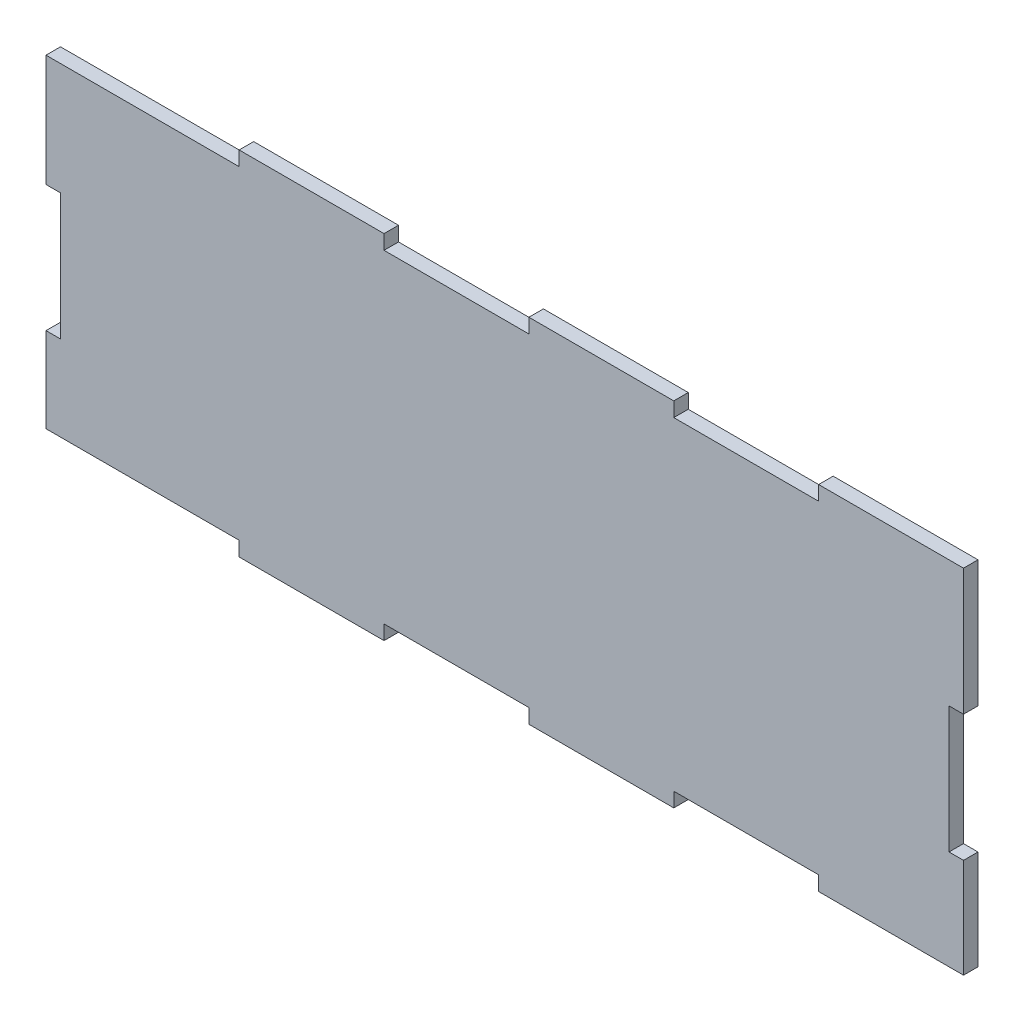
ISO-10303-21;
HEADER;
FILE_DESCRIPTION(('STEP AP214'),'2;1');
FILE_NAME('part.step','',(''),(''),'','','');
FILE_SCHEMA(('AUTOMOTIVE_DESIGN { 1 0 10303 214 1 1 1 1 }'));
ENDSEC;
DATA;
#1=APPLICATION_CONTEXT('core data for automotive mechanical design processes');
#2=APPLICATION_PROTOCOL_DEFINITION('international standard','automotive_design',2000,#1);
#3=PRODUCT_CONTEXT('',#1,'mechanical');
#4=PRODUCT('Part','Part','',(#3));
#5=PRODUCT_RELATED_PRODUCT_CATEGORY('part','',(#4));
#6=PRODUCT_DEFINITION_FORMATION('','',#4);
#7=PRODUCT_DEFINITION_CONTEXT('part definition',#1,'design');
#8=PRODUCT_DEFINITION('design','',#6,#7);
#9=PRODUCT_DEFINITION_SHAPE('','',#8);
#10=(LENGTH_UNIT() NAMED_UNIT(*) SI_UNIT(.MILLI.,.METRE.));
#11=(NAMED_UNIT(*) PLANE_ANGLE_UNIT() SI_UNIT($,.RADIAN.));
#12=(NAMED_UNIT(*) SI_UNIT($,.STERADIAN.) SOLID_ANGLE_UNIT());
#13=UNCERTAINTY_MEASURE_WITH_UNIT(LENGTH_MEASURE(1.E-05),#10,'distance_accuracy_value','');
#14=(GEOMETRIC_REPRESENTATION_CONTEXT(3) GLOBAL_UNCERTAINTY_ASSIGNED_CONTEXT((#13)) GLOBAL_UNIT_ASSIGNED_CONTEXT((#10,
#11,#12)) REPRESENTATION_CONTEXT('',''));
#15=CARTESIAN_POINT('',(0.,0.,0.));
#16=DIRECTION('',(0.,0.,1.));
#17=DIRECTION('',(1.,0.,0.));
#18=AXIS2_PLACEMENT_3D('',#15,#16,#17);
#19=CARTESIAN_POINT('',(0.,46.8,3.));
#20=DIRECTION('',(0.,1.,0.));
#21=DIRECTION('',(0.,0.,1.));
#22=AXIS2_PLACEMENT_3D('',#19,#20,#21);
#23=PLANE('',#22);
#24=DIRECTION('',(1.,0.,0.));
#25=VECTOR('',#24,1.);
#26=CARTESIAN_POINT('',(0.,46.8,0.));
#27=LINE('',#26,#25);
#28=CARTESIAN_POINT('',(-10.,46.8,0.));
#29=VERTEX_POINT('',#28);
#30=CARTESIAN_POINT('',(-7.,46.8,0.));
#31=VERTEX_POINT('',#30);
#32=EDGE_CURVE('E274',#29,#31,#27,.T.);
#33=ORIENTED_EDGE('',*,*,#32,.T.);
#34=DIRECTION('',(0.,0.,-1.));
#35=VECTOR('',#34,1.);
#36=CARTESIAN_POINT('',(-7.,46.8,3.));
#37=LINE('',#36,#35);
#38=CARTESIAN_POINT('',(-7.,46.8,3.));
#39=VERTEX_POINT('',#38);
#40=EDGE_CURVE('E11',#39,#31,#37,.T.);
#41=ORIENTED_EDGE('',*,*,#40,.F.);
#42=DIRECTION('',(1.,0.,0.));
#43=VECTOR('',#42,1.);
#44=CARTESIAN_POINT('',(0.,46.8,3.));
#45=LINE('',#44,#43);
#46=CARTESIAN_POINT('',(-10.,46.8,3.));
#47=VERTEX_POINT('',#46);
#48=EDGE_CURVE('E529',#47,#39,#45,.T.);
#49=ORIENTED_EDGE('',*,*,#48,.F.);
#50=DIRECTION('',(0.,0.,-1.));
#51=VECTOR('',#50,1.);
#52=CARTESIAN_POINT('',(-10.,46.8,3.));
#53=LINE('',#52,#51);
#54=EDGE_CURVE('E269',#47,#29,#53,.T.);
#55=ORIENTED_EDGE('',*,*,#54,.T.);
#56=EDGE_LOOP('',(#33,#41,#49,#55));
#57=FACE_BOUND('',#56,.T.);
#58=ADVANCED_FACE('F34',(#57),#23,.F.);
#59=CARTESIAN_POINT('',(-6.99999999999999,0.,3.));
#60=DIRECTION('',(1.,0.,0.));
#61=DIRECTION('',(0.,1.,0.));
#62=AXIS2_PLACEMENT_3D('',#59,#60,#61);
#63=PLANE('',#62);
#64=DIRECTION('',(0.,-1.,0.));
#65=VECTOR('',#64,1.);
#66=CARTESIAN_POINT('',(-6.99999999999999,0.,0.));
#67=LINE('',#66,#65);
#68=CARTESIAN_POINT('',(-6.99999999999999,20.6,0.));
#69=VERTEX_POINT('',#68);
#70=EDGE_CURVE('E277',#31,#69,#67,.T.);
#71=ORIENTED_EDGE('',*,*,#70,.T.);
#72=DIRECTION('',(0.,0.,-1.));
#73=VECTOR('',#72,1.);
#74=CARTESIAN_POINT('',(-6.99999999999999,20.6,3.));
#75=LINE('',#74,#73);
#76=CARTESIAN_POINT('',(-6.99999999999999,20.6,3.));
#77=VERTEX_POINT('',#76);
#78=EDGE_CURVE('E42',#77,#69,#75,.T.);
#79=ORIENTED_EDGE('',*,*,#78,.F.);
#80=DIRECTION('',(0.,-1.,0.));
#81=VECTOR('',#80,1.);
#82=CARTESIAN_POINT('',(-6.99999999999999,0.,3.));
#83=LINE('',#82,#81);
#84=EDGE_CURVE('E161',#39,#77,#83,.T.);
#85=ORIENTED_EDGE('',*,*,#84,.F.);
#86=ORIENTED_EDGE('',*,*,#40,.T.);
#87=EDGE_LOOP('',(#71,#79,#85,#86));
#88=FACE_BOUND('',#87,.T.);
#89=ADVANCED_FACE('F415',(#88),#63,.F.);
#90=CARTESIAN_POINT('',(0.,20.6,3.));
#91=DIRECTION('',(0.,1.,0.));
#92=DIRECTION('',(0.,0.,1.));
#93=AXIS2_PLACEMENT_3D('',#90,#91,#92);
#94=PLANE('',#93);
#95=DIRECTION('',(1.,0.,0.));
#96=VECTOR('',#95,1.);
#97=CARTESIAN_POINT('',(0.,20.6,0.));
#98=LINE('',#97,#96);
#99=CARTESIAN_POINT('',(-9.99999999999999,20.6,0.));
#100=VERTEX_POINT('',#99);
#101=EDGE_CURVE('E280',#100,#69,#98,.T.);
#102=ORIENTED_EDGE('',*,*,#101,.F.);
#103=DIRECTION('',(0.,0.,-1.));
#104=VECTOR('',#103,1.);
#105=CARTESIAN_POINT('',(-9.99999999999999,20.6,3.));
#106=LINE('',#105,#104);
#107=CARTESIAN_POINT('',(-9.99999999999999,20.6,3.));
#108=VERTEX_POINT('',#107);
#109=EDGE_CURVE('E408',#108,#100,#106,.T.);
#110=ORIENTED_EDGE('',*,*,#109,.F.);
#111=DIRECTION('',(1.,0.,0.));
#112=VECTOR('',#111,1.);
#113=CARTESIAN_POINT('',(0.,20.6,3.));
#114=LINE('',#113,#112);
#115=EDGE_CURVE('E414',#108,#77,#114,.T.);
#116=ORIENTED_EDGE('',*,*,#115,.T.);
#117=ORIENTED_EDGE('',*,*,#78,.T.);
#118=EDGE_LOOP('',(#102,#110,#116,#117));
#119=FACE_BOUND('',#118,.T.);
#120=ADVANCED_FACE('F412',(#119),#94,.T.);
#121=CARTESIAN_POINT('',(-9.99999999999999,0.,3.));
#122=DIRECTION('',(1.,0.,0.));
#123=DIRECTION('',(0.,1.,0.));
#124=AXIS2_PLACEMENT_3D('',#121,#122,#123);
#125=PLANE('',#124);
#126=DIRECTION('',(0.,-1.,0.));
#127=VECTOR('',#126,1.);
#128=CARTESIAN_POINT('',(-9.99999999999999,0.,0.));
#129=LINE('',#128,#127);
#130=CARTESIAN_POINT('',(-9.99999999999999,2.99999999999999,0.));
#131=VERTEX_POINT('',#130);
#132=EDGE_CURVE('E283',#100,#131,#129,.T.);
#133=ORIENTED_EDGE('',*,*,#132,.T.);
#134=DIRECTION('',(0.,0.,-1.));
#135=VECTOR('',#134,1.);
#136=CARTESIAN_POINT('',(-9.99999999999999,2.99999999999999,3.));
#137=LINE('',#136,#135);
#138=CARTESIAN_POINT('',(-9.99999999999999,2.99999999999999,3.));
#139=VERTEX_POINT('',#138);
#140=EDGE_CURVE('E405',#139,#131,#137,.T.);
#141=ORIENTED_EDGE('',*,*,#140,.F.);
#142=DIRECTION('',(0.,-1.,0.));
#143=VECTOR('',#142,1.);
#144=CARTESIAN_POINT('',(-9.99999999999999,0.,3.));
#145=LINE('',#144,#143);
#146=EDGE_CURVE('E271',#108,#139,#145,.T.);
#147=ORIENTED_EDGE('',*,*,#146,.F.);
#148=ORIENTED_EDGE('',*,*,#109,.T.);
#149=EDGE_LOOP('',(#133,#141,#147,#148));
#150=FACE_BOUND('',#149,.T.);
#151=ADVANCED_FACE('F425',(#150),#125,.F.);
#152=CARTESIAN_POINT('',(0.,2.99999999999999,3.));
#153=DIRECTION('',(0.,1.,0.));
#154=DIRECTION('',(0.,0.,1.));
#155=AXIS2_PLACEMENT_3D('',#152,#153,#154);
#156=PLANE('',#155);
#157=DIRECTION('',(1.,0.,0.));
#158=VECTOR('',#157,1.);
#159=CARTESIAN_POINT('',(0.,2.99999999999999,0.));
#160=LINE('',#159,#158);
#161=CARTESIAN_POINT('',(30.0000000000017,2.99999999999999,0.));
#162=VERTEX_POINT('',#161);
#163=EDGE_CURVE('E285',#131,#162,#160,.T.);
#164=ORIENTED_EDGE('',*,*,#163,.T.);
#165=DIRECTION('',(0.,0.,-1.));
#166=VECTOR('',#165,1.);
#167=CARTESIAN_POINT('',(30.0000000000017,2.99999999999999,3.));
#168=LINE('',#167,#166);
#169=CARTESIAN_POINT('',(30.0000000000017,2.99999999999999,3.));
#170=VERTEX_POINT('',#169);
#171=EDGE_CURVE('E402',#170,#162,#168,.T.);
#172=ORIENTED_EDGE('',*,*,#171,.F.);
#173=DIRECTION('',(1.,0.,0.));
#174=VECTOR('',#173,1.);
#175=CARTESIAN_POINT('',(0.,2.99999999999999,3.));
#176=LINE('',#175,#174);
#177=EDGE_CURVE('E431',#139,#170,#176,.T.);
#178=ORIENTED_EDGE('',*,*,#177,.F.);
#179=ORIENTED_EDGE('',*,*,#140,.T.);
#180=EDGE_LOOP('',(#164,#172,#178,#179));
#181=FACE_BOUND('',#180,.T.);
#182=ADVANCED_FACE('F429',(#181),#156,.F.);
#183=CARTESIAN_POINT('',(30.0000000000017,0.,3.));
#184=DIRECTION('',(1.,0.,0.));
#185=DIRECTION('',(0.,0.,-1.));
#186=AXIS2_PLACEMENT_3D('',#183,#184,#185);
#187=PLANE('',#186);
#188=DIRECTION('',(0.,-1.,0.));
#189=VECTOR('',#188,1.);
#190=CARTESIAN_POINT('',(30.0000000000017,0.,0.));
#191=LINE('',#190,#189);
#192=CARTESIAN_POINT('',(30.0000000000017,0.,0.));
#193=VERTEX_POINT('',#192);
#194=EDGE_CURVE('E287',#162,#193,#191,.T.);
#195=ORIENTED_EDGE('',*,*,#194,.T.);
#196=DIRECTION('',(0.,0.,-1.));
#197=VECTOR('',#196,1.);
#198=CARTESIAN_POINT('',(30.0000000000017,0.,3.));
#199=LINE('',#198,#197);
#200=CARTESIAN_POINT('',(30.0000000000017,0.,3.));
#201=VERTEX_POINT('',#200);
#202=EDGE_CURVE('E399',#201,#193,#199,.T.);
#203=ORIENTED_EDGE('',*,*,#202,.F.);
#204=DIRECTION('',(0.,-1.,0.));
#205=VECTOR('',#204,1.);
#206=CARTESIAN_POINT('',(30.0000000000017,0.,3.));
#207=LINE('',#206,#205);
#208=EDGE_CURVE('E433',#170,#201,#207,.T.);
#209=ORIENTED_EDGE('',*,*,#208,.F.);
#210=ORIENTED_EDGE('',*,*,#171,.T.);
#211=EDGE_LOOP('',(#195,#203,#209,#210));
#212=FACE_BOUND('',#211,.T.);
#213=ADVANCED_FACE('F547',(#212),#187,.F.);
#214=CARTESIAN_POINT('',(0.,0.,3.));
#215=DIRECTION('',(0.,1.,0.));
#216=DIRECTION('',(0.,0.,1.));
#217=AXIS2_PLACEMENT_3D('',#214,#215,#216);
#218=PLANE('',#217);
#219=DIRECTION('',(1.,0.,0.));
#220=VECTOR('',#219,1.);
#221=CARTESIAN_POINT('',(0.,0.,0.));
#222=LINE('',#221,#220);
#223=CARTESIAN_POINT('',(60.0000000000017,0.,0.));
#224=VERTEX_POINT('',#223);
#225=EDGE_CURVE('E289',#193,#224,#222,.T.);
#226=ORIENTED_EDGE('',*,*,#225,.T.);
#227=DIRECTION('',(0.,0.,-1.));
#228=VECTOR('',#227,1.);
#229=CARTESIAN_POINT('',(60.0000000000017,0.,3.));
#230=LINE('',#229,#228);
#231=CARTESIAN_POINT('',(60.0000000000017,0.,3.));
#232=VERTEX_POINT('',#231);
#233=EDGE_CURVE('E397',#232,#224,#230,.T.);
#234=ORIENTED_EDGE('',*,*,#233,.F.);
#235=DIRECTION('',(1.,0.,0.));
#236=VECTOR('',#235,1.);
#237=CARTESIAN_POINT('',(0.,0.,3.));
#238=LINE('',#237,#236);
#239=EDGE_CURVE('E435',#201,#232,#238,.T.);
#240=ORIENTED_EDGE('',*,*,#239,.F.);
#241=ORIENTED_EDGE('',*,*,#202,.T.);
#242=EDGE_LOOP('',(#226,#234,#240,#241));
#243=FACE_BOUND('',#242,.T.);
#244=ADVANCED_FACE('F555',(#243),#218,.F.);
#245=CARTESIAN_POINT('',(60.0000000000017,0.,3.));
#246=DIRECTION('',(1.,0.,0.));
#247=DIRECTION('',(0.,0.,-1.));
#248=AXIS2_PLACEMENT_3D('',#245,#246,#247);
#249=PLANE('',#248);
#250=DIRECTION('',(0.,-1.,0.));
#251=VECTOR('',#250,1.);
#252=CARTESIAN_POINT('',(60.0000000000017,0.,0.));
#253=LINE('',#252,#251);
#254=CARTESIAN_POINT('',(60.0000000000017,2.99999999999999,0.));
#255=VERTEX_POINT('',#254);
#256=EDGE_CURVE('E292',#255,#224,#253,.T.);
#257=ORIENTED_EDGE('',*,*,#256,.F.);
#258=DIRECTION('',(0.,0.,-1.));
#259=VECTOR('',#258,1.);
#260=CARTESIAN_POINT('',(60.0000000000017,2.99999999999999,3.));
#261=LINE('',#260,#259);
#262=CARTESIAN_POINT('',(60.0000000000017,2.99999999999999,3.));
#263=VERTEX_POINT('',#262);
#264=EDGE_CURVE('E395',#263,#255,#261,.T.);
#265=ORIENTED_EDGE('',*,*,#264,.F.);
#266=DIRECTION('',(0.,-1.,0.));
#267=VECTOR('',#266,1.);
#268=CARTESIAN_POINT('',(60.0000000000017,0.,3.));
#269=LINE('',#268,#267);
#270=EDGE_CURVE('E440',#263,#232,#269,.T.);
#271=ORIENTED_EDGE('',*,*,#270,.T.);
#272=ORIENTED_EDGE('',*,*,#233,.T.);
#273=EDGE_LOOP('',(#257,#265,#271,#272));
#274=FACE_BOUND('',#273,.T.);
#275=ADVANCED_FACE('F557',(#274),#249,.T.);
#276=CARTESIAN_POINT('',(0.,2.99999999999999,3.));
#277=DIRECTION('',(0.,1.,0.));
#278=DIRECTION('',(0.,0.,1.));
#279=AXIS2_PLACEMENT_3D('',#276,#277,#278);
#280=PLANE('',#279);
#281=DIRECTION('',(1.,0.,0.));
#282=VECTOR('',#281,1.);
#283=CARTESIAN_POINT('',(0.,2.99999999999999,0.));
#284=LINE('',#283,#282);
#285=CARTESIAN_POINT('',(90.0000000000017,2.99999999999999,0.));
#286=VERTEX_POINT('',#285);
#287=EDGE_CURVE('E297',#255,#286,#284,.T.);
#288=ORIENTED_EDGE('',*,*,#287,.T.);
#289=DIRECTION('',(0.,0.,-1.));
#290=VECTOR('',#289,1.);
#291=CARTESIAN_POINT('',(90.0000000000017,2.99999999999999,3.));
#292=LINE('',#291,#290);
#293=CARTESIAN_POINT('',(90.0000000000017,2.99999999999999,3.));
#294=VERTEX_POINT('',#293);
#295=EDGE_CURVE('E392',#294,#286,#292,.T.);
#296=ORIENTED_EDGE('',*,*,#295,.F.);
#297=DIRECTION('',(1.,0.,0.));
#298=VECTOR('',#297,1.);
#299=CARTESIAN_POINT('',(0.,2.99999999999999,3.));
#300=LINE('',#299,#298);
#301=EDGE_CURVE('E445',#263,#294,#300,.T.);
#302=ORIENTED_EDGE('',*,*,#301,.F.);
#303=ORIENTED_EDGE('',*,*,#264,.T.);
#304=EDGE_LOOP('',(#288,#296,#302,#303));
#305=FACE_BOUND('',#304,.T.);
#306=ADVANCED_FACE('F560',(#305),#280,.F.);
#307=CARTESIAN_POINT('',(90.0000000000017,0.,3.));
#308=DIRECTION('',(1.,0.,0.));
#309=DIRECTION('',(0.,0.,-1.));
#310=AXIS2_PLACEMENT_3D('',#307,#308,#309);
#311=PLANE('',#310);
#312=DIRECTION('',(0.,-1.,0.));
#313=VECTOR('',#312,1.);
#314=CARTESIAN_POINT('',(90.0000000000017,0.,0.));
#315=LINE('',#314,#313);
#316=CARTESIAN_POINT('',(90.0000000000017,0.,0.));
#317=VERTEX_POINT('',#316);
#318=EDGE_CURVE('E299',#286,#317,#315,.T.);
#319=ORIENTED_EDGE('',*,*,#318,.T.);
#320=DIRECTION('',(0.,0.,-1.));
#321=VECTOR('',#320,1.);
#322=CARTESIAN_POINT('',(90.0000000000017,0.,3.));
#323=LINE('',#322,#321);
#324=CARTESIAN_POINT('',(90.0000000000017,0.,3.));
#325=VERTEX_POINT('',#324);
#326=EDGE_CURVE('E389',#325,#317,#323,.T.);
#327=ORIENTED_EDGE('',*,*,#326,.F.);
#328=DIRECTION('',(0.,-1.,0.));
#329=VECTOR('',#328,1.);
#330=CARTESIAN_POINT('',(90.0000000000017,0.,3.));
#331=LINE('',#330,#329);
#332=EDGE_CURVE('E447',#294,#325,#331,.T.);
#333=ORIENTED_EDGE('',*,*,#332,.F.);
#334=ORIENTED_EDGE('',*,*,#295,.T.);
#335=EDGE_LOOP('',(#319,#327,#333,#334));
#336=FACE_BOUND('',#335,.T.);
#337=ADVANCED_FACE('F564',(#336),#311,.F.);
#338=CARTESIAN_POINT('',(120.000000000002,0.,0.));
#339=VERTEX_POINT('',#338);
#340=EDGE_CURVE('E294',#317,#339,#222,.T.);
#341=ORIENTED_EDGE('',*,*,#340,.T.);
#342=DIRECTION('',(0.,0.,-1.));
#343=VECTOR('',#342,1.);
#344=CARTESIAN_POINT('',(120.000000000002,0.,3.));
#345=LINE('',#344,#343);
#346=CARTESIAN_POINT('',(120.000000000002,0.,3.));
#347=VERTEX_POINT('',#346);
#348=EDGE_CURVE('E387',#347,#339,#345,.T.);
#349=ORIENTED_EDGE('',*,*,#348,.F.);
#350=EDGE_CURVE('E442',#325,#347,#238,.T.);
#351=ORIENTED_EDGE('',*,*,#350,.F.);
#352=ORIENTED_EDGE('',*,*,#326,.T.);
#353=EDGE_LOOP('',(#341,#349,#351,#352));
#354=FACE_BOUND('',#353,.T.);
#355=ADVANCED_FACE('F568',(#354),#218,.F.);
#356=CARTESIAN_POINT('',(120.000000000002,0.,3.));
#357=DIRECTION('',(1.,0.,0.));
#358=DIRECTION('',(0.,0.,-1.));
#359=AXIS2_PLACEMENT_3D('',#356,#357,#358);
#360=PLANE('',#359);
#361=DIRECTION('',(0.,-1.,0.));
#362=VECTOR('',#361,1.);
#363=CARTESIAN_POINT('',(120.000000000002,0.,0.));
#364=LINE('',#363,#362);
#365=CARTESIAN_POINT('',(120.000000000002,2.99999999999999,0.));
#366=VERTEX_POINT('',#365);
#367=EDGE_CURVE('E301',#366,#339,#364,.T.);
#368=ORIENTED_EDGE('',*,*,#367,.F.);
#369=DIRECTION('',(0.,0.,-1.));
#370=VECTOR('',#369,1.);
#371=CARTESIAN_POINT('',(120.000000000002,2.99999999999999,3.));
#372=LINE('',#371,#370);
#373=CARTESIAN_POINT('',(120.000000000002,2.99999999999999,3.));
#374=VERTEX_POINT('',#373);
#375=EDGE_CURVE('E385',#374,#366,#372,.T.);
#376=ORIENTED_EDGE('',*,*,#375,.F.);
#377=DIRECTION('',(0.,-1.,0.));
#378=VECTOR('',#377,1.);
#379=CARTESIAN_POINT('',(120.000000000002,0.,3.));
#380=LINE('',#379,#378);
#381=EDGE_CURVE('E449',#374,#347,#380,.T.);
#382=ORIENTED_EDGE('',*,*,#381,.T.);
#383=ORIENTED_EDGE('',*,*,#348,.T.);
#384=EDGE_LOOP('',(#368,#376,#382,#383));
#385=FACE_BOUND('',#384,.T.);
#386=ADVANCED_FACE('F570',(#385),#360,.T.);
#387=CARTESIAN_POINT('',(0.,2.99999999999999,3.));
#388=DIRECTION('',(0.,1.,0.));
#389=DIRECTION('',(0.,0.,1.));
#390=AXIS2_PLACEMENT_3D('',#387,#388,#389);
#391=PLANE('',#390);
#392=DIRECTION('',(1.,0.,0.));
#393=VECTOR('',#392,1.);
#394=CARTESIAN_POINT('',(0.,2.99999999999999,0.));
#395=LINE('',#394,#393);
#396=CARTESIAN_POINT('',(150.000000000002,2.99999999999999,0.));
#397=VERTEX_POINT('',#396);
#398=EDGE_CURVE('E304',#366,#397,#395,.T.);
#399=ORIENTED_EDGE('',*,*,#398,.T.);
#400=DIRECTION('',(0.,0.,-1.));
#401=VECTOR('',#400,1.);
#402=CARTESIAN_POINT('',(150.000000000002,2.99999999999999,3.));
#403=LINE('',#402,#401);
#404=CARTESIAN_POINT('',(150.000000000002,2.99999999999999,3.));
#405=VERTEX_POINT('',#404);
#406=EDGE_CURVE('E382',#405,#397,#403,.T.);
#407=ORIENTED_EDGE('',*,*,#406,.F.);
#408=DIRECTION('',(1.,0.,0.));
#409=VECTOR('',#408,1.);
#410=CARTESIAN_POINT('',(0.,2.99999999999999,3.));
#411=LINE('',#410,#409);
#412=EDGE_CURVE('E452',#374,#405,#411,.T.);
#413=ORIENTED_EDGE('',*,*,#412,.F.);
#414=ORIENTED_EDGE('',*,*,#375,.T.);
#415=EDGE_LOOP('',(#399,#407,#413,#414));
#416=FACE_BOUND('',#415,.T.);
#417=ADVANCED_FACE('F573',(#416),#391,.F.);
#418=CARTESIAN_POINT('',(150.000000000002,0.,3.));
#419=DIRECTION('',(1.,0.,0.));
#420=DIRECTION('',(0.,0.,-1.));
#421=AXIS2_PLACEMENT_3D('',#418,#419,#420);
#422=PLANE('',#421);
#423=DIRECTION('',(0.,-1.,0.));
#424=VECTOR('',#423,1.);
#425=CARTESIAN_POINT('',(150.000000000002,0.,0.));
#426=LINE('',#425,#424);
#427=CARTESIAN_POINT('',(150.000000000002,0.,0.));
#428=VERTEX_POINT('',#427);
#429=EDGE_CURVE('E306',#397,#428,#426,.T.);
#430=ORIENTED_EDGE('',*,*,#429,.T.);
#431=DIRECTION('',(0.,0.,-1.));
#432=VECTOR('',#431,1.);
#433=CARTESIAN_POINT('',(150.000000000002,0.,3.));
#434=LINE('',#433,#432);
#435=CARTESIAN_POINT('',(150.000000000002,0.,3.));
#436=VERTEX_POINT('',#435);
#437=EDGE_CURVE('E379',#436,#428,#434,.T.);
#438=ORIENTED_EDGE('',*,*,#437,.F.);
#439=DIRECTION('',(0.,-1.,0.));
#440=VECTOR('',#439,1.);
#441=CARTESIAN_POINT('',(150.000000000002,0.,3.));
#442=LINE('',#441,#440);
#443=EDGE_CURVE('E454',#405,#436,#442,.T.);
#444=ORIENTED_EDGE('',*,*,#443,.F.);
#445=ORIENTED_EDGE('',*,*,#406,.T.);
#446=EDGE_LOOP('',(#430,#438,#444,#445));
#447=FACE_BOUND('',#446,.T.);
#448=ADVANCED_FACE('F577',(#447),#422,.F.);
#449=CARTESIAN_POINT('',(180.,0.,0.));
#450=VERTEX_POINT('',#449);
#451=EDGE_CURVE('E293',#428,#450,#222,.T.);
#452=ORIENTED_EDGE('',*,*,#451,.T.);
#453=DIRECTION('',(0.,0.,-1.));
#454=VECTOR('',#453,1.);
#455=CARTESIAN_POINT('',(180.,0.,3.));
#456=LINE('',#455,#454);
#457=CARTESIAN_POINT('',(180.,0.,3.));
#458=VERTEX_POINT('',#457);
#459=EDGE_CURVE('E376',#458,#450,#456,.T.);
#460=ORIENTED_EDGE('',*,*,#459,.F.);
#461=EDGE_CURVE('E441',#436,#458,#238,.T.);
#462=ORIENTED_EDGE('',*,*,#461,.F.);
#463=ORIENTED_EDGE('',*,*,#437,.T.);
#464=EDGE_LOOP('',(#452,#460,#462,#463));
#465=FACE_BOUND('',#464,.T.);
#466=ADVANCED_FACE('F581',(#465),#218,.F.);
#467=CARTESIAN_POINT('',(180.,0.,3.));
#468=DIRECTION('',(-1.,0.,0.));
#469=DIRECTION('',(0.,0.,1.));
#470=AXIS2_PLACEMENT_3D('',#467,#468,#469);
#471=PLANE('',#470);
#472=DIRECTION('',(0.,1.,0.));
#473=VECTOR('',#472,1.);
#474=CARTESIAN_POINT('',(180.,0.,0.));
#475=LINE('',#474,#473);
#476=CARTESIAN_POINT('',(180.,20.6,0.));
#477=VERTEX_POINT('',#476);
#478=EDGE_CURVE('E308',#450,#477,#475,.T.);
#479=ORIENTED_EDGE('',*,*,#478,.T.);
#480=DIRECTION('',(0.,0.,-1.));
#481=VECTOR('',#480,1.);
#482=CARTESIAN_POINT('',(180.,20.6,3.));
#483=LINE('',#482,#481);
#484=CARTESIAN_POINT('',(180.,20.6,3.));
#485=VERTEX_POINT('',#484);
#486=EDGE_CURVE('E374',#485,#477,#483,.T.);
#487=ORIENTED_EDGE('',*,*,#486,.F.);
#488=DIRECTION('',(0.,1.,0.));
#489=VECTOR('',#488,1.);
#490=CARTESIAN_POINT('',(180.,0.,3.));
#491=LINE('',#490,#489);
#492=EDGE_CURVE('E456',#458,#485,#491,.T.);
#493=ORIENTED_EDGE('',*,*,#492,.F.);
#494=ORIENTED_EDGE('',*,*,#459,.T.);
#495=EDGE_LOOP('',(#479,#487,#493,#494));
#496=FACE_BOUND('',#495,.T.);
#497=ADVANCED_FACE('F585',(#496),#471,.F.);
#498=CARTESIAN_POINT('',(0.,20.6,3.));
#499=DIRECTION('',(0.,1.,0.));
#500=DIRECTION('',(0.,0.,1.));
#501=AXIS2_PLACEMENT_3D('',#498,#499,#500);
#502=PLANE('',#501);
#503=DIRECTION('',(1.,0.,0.));
#504=VECTOR('',#503,1.);
#505=CARTESIAN_POINT('',(0.,20.6,0.));
#506=LINE('',#505,#504);
#507=CARTESIAN_POINT('',(177.,20.6,0.));
#508=VERTEX_POINT('',#507);
#509=EDGE_CURVE('E311',#508,#477,#506,.T.);
#510=ORIENTED_EDGE('',*,*,#509,.F.);
#511=DIRECTION('',(0.,0.,-1.));
#512=VECTOR('',#511,1.);
#513=CARTESIAN_POINT('',(177.,20.6,3.));
#514=LINE('',#513,#512);
#515=CARTESIAN_POINT('',(177.,20.6,3.));
#516=VERTEX_POINT('',#515);
#517=EDGE_CURVE('E372',#516,#508,#514,.T.);
#518=ORIENTED_EDGE('',*,*,#517,.F.);
#519=DIRECTION('',(1.,0.,0.));
#520=VECTOR('',#519,1.);
#521=CARTESIAN_POINT('',(0.,20.6,3.));
#522=LINE('',#521,#520);
#523=EDGE_CURVE('E458',#516,#485,#522,.T.);
#524=ORIENTED_EDGE('',*,*,#523,.T.);
#525=ORIENTED_EDGE('',*,*,#486,.T.);
#526=EDGE_LOOP('',(#510,#518,#524,#525));
#527=FACE_BOUND('',#526,.T.);
#528=ADVANCED_FACE('F587',(#527),#502,.T.);
#529=CARTESIAN_POINT('',(177.,0.,3.));
#530=DIRECTION('',(1.,0.,0.));
#531=DIRECTION('',(0.,0.,-1.));
#532=AXIS2_PLACEMENT_3D('',#529,#530,#531);
#533=PLANE('',#532);
#534=DIRECTION('',(0.,-1.,0.));
#535=VECTOR('',#534,1.);
#536=CARTESIAN_POINT('',(177.,0.,0.));
#537=LINE('',#536,#535);
#538=CARTESIAN_POINT('',(177.,46.8,0.));
#539=VERTEX_POINT('',#538);
#540=EDGE_CURVE('E315',#539,#508,#537,.T.);
#541=ORIENTED_EDGE('',*,*,#540,.F.);
#542=DIRECTION('',(0.,0.,-1.));
#543=VECTOR('',#542,1.);
#544=CARTESIAN_POINT('',(177.,46.8,3.));
#545=LINE('',#544,#543);
#546=CARTESIAN_POINT('',(177.,46.8,3.));
#547=VERTEX_POINT('',#546);
#548=EDGE_CURVE('E370',#547,#539,#545,.T.);
#549=ORIENTED_EDGE('',*,*,#548,.F.);
#550=DIRECTION('',(0.,-1.,0.));
#551=VECTOR('',#550,1.);
#552=CARTESIAN_POINT('',(177.,0.,3.));
#553=LINE('',#552,#551);
#554=EDGE_CURVE('E462',#547,#516,#553,.T.);
#555=ORIENTED_EDGE('',*,*,#554,.T.);
#556=ORIENTED_EDGE('',*,*,#517,.T.);
#557=EDGE_LOOP('',(#541,#549,#555,#556));
#558=FACE_BOUND('',#557,.T.);
#559=ADVANCED_FACE('F590',(#558),#533,.T.);
#560=CARTESIAN_POINT('',(0.,46.8,3.));
#561=DIRECTION('',(0.,1.,0.));
#562=DIRECTION('',(0.,0.,1.));
#563=AXIS2_PLACEMENT_3D('',#560,#561,#562);
#564=PLANE('',#563);
#565=DIRECTION('',(1.,0.,0.));
#566=VECTOR('',#565,1.);
#567=CARTESIAN_POINT('',(0.,46.8,0.));
#568=LINE('',#567,#566);
#569=CARTESIAN_POINT('',(180.,46.8,0.));
#570=VERTEX_POINT('',#569);
#571=EDGE_CURVE('E318',#539,#570,#568,.T.);
#572=ORIENTED_EDGE('',*,*,#571,.T.);
#573=DIRECTION('',(0.,0.,-1.));
#574=VECTOR('',#573,1.);
#575=CARTESIAN_POINT('',(180.,46.8,3.));
#576=LINE('',#575,#574);
#577=CARTESIAN_POINT('',(180.,46.8,3.));
#578=VERTEX_POINT('',#577);
#579=EDGE_CURVE('E367',#578,#570,#576,.T.);
#580=ORIENTED_EDGE('',*,*,#579,.F.);
#581=DIRECTION('',(1.,0.,0.));
#582=VECTOR('',#581,1.);
#583=CARTESIAN_POINT('',(0.,46.8,3.));
#584=LINE('',#583,#582);
#585=EDGE_CURVE('E465',#547,#578,#584,.T.);
#586=ORIENTED_EDGE('',*,*,#585,.F.);
#587=ORIENTED_EDGE('',*,*,#548,.T.);
#588=EDGE_LOOP('',(#572,#580,#586,#587));
#589=FACE_BOUND('',#588,.T.);
#590=ADVANCED_FACE('F594',(#589),#564,.F.);
#591=CARTESIAN_POINT('',(180.,73.,0.));
#592=VERTEX_POINT('',#591);
#593=EDGE_CURVE('E312',#570,#592,#475,.T.);
#594=ORIENTED_EDGE('',*,*,#593,.T.);
#595=DIRECTION('',(0.,0.,-1.));
#596=VECTOR('',#595,1.);
#597=CARTESIAN_POINT('',(180.,73.,3.));
#598=LINE('',#597,#596);
#599=CARTESIAN_POINT('',(180.,73.,3.));
#600=VERTEX_POINT('',#599);
#601=EDGE_CURVE('E365',#600,#592,#598,.T.);
#602=ORIENTED_EDGE('',*,*,#601,.F.);
#603=EDGE_CURVE('E459',#578,#600,#491,.T.);
#604=ORIENTED_EDGE('',*,*,#603,.F.);
#605=ORIENTED_EDGE('',*,*,#579,.T.);
#606=EDGE_LOOP('',(#594,#602,#604,#605));
#607=FACE_BOUND('',#606,.T.);
#608=ADVANCED_FACE('F598',(#607),#471,.F.);
#609=CARTESIAN_POINT('',(0.,73.,3.));
#610=DIRECTION('',(0.,1.,0.));
#611=DIRECTION('',(0.,0.,1.));
#612=AXIS2_PLACEMENT_3D('',#609,#610,#611);
#613=PLANE('',#612);
#614=DIRECTION('',(1.,0.,0.));
#615=VECTOR('',#614,1.);
#616=CARTESIAN_POINT('',(0.,73.,0.));
#617=LINE('',#616,#615);
#618=CARTESIAN_POINT('',(150.,73.,0.));
#619=VERTEX_POINT('',#618);
#620=EDGE_CURVE('E320',#619,#592,#617,.T.);
#621=ORIENTED_EDGE('',*,*,#620,.F.);
#622=DIRECTION('',(0.,0.,-1.));
#623=VECTOR('',#622,1.);
#624=CARTESIAN_POINT('',(150.,73.,3.));
#625=LINE('',#624,#623);
#626=CARTESIAN_POINT('',(150.,73.,3.));
#627=VERTEX_POINT('',#626);
#628=EDGE_CURVE('E363',#627,#619,#625,.T.);
#629=ORIENTED_EDGE('',*,*,#628,.F.);
#630=DIRECTION('',(1.,0.,0.));
#631=VECTOR('',#630,1.);
#632=CARTESIAN_POINT('',(0.,73.,3.));
#633=LINE('',#632,#631);
#634=EDGE_CURVE('E467',#627,#600,#633,.T.);
#635=ORIENTED_EDGE('',*,*,#634,.T.);
#636=ORIENTED_EDGE('',*,*,#601,.T.);
#637=EDGE_LOOP('',(#621,#629,#635,#636));
#638=FACE_BOUND('',#637,.T.);
#639=ADVANCED_FACE('F521',(#638),#613,.T.);
#640=CARTESIAN_POINT('',(150.,0.,3.));
#641=DIRECTION('',(1.,0.,0.));
#642=DIRECTION('',(0.,0.,-1.));
#643=AXIS2_PLACEMENT_3D('',#640,#641,#642);
#644=PLANE('',#643);
#645=DIRECTION('',(0.,-1.,0.));
#646=VECTOR('',#645,1.);
#647=CARTESIAN_POINT('',(150.,0.,0.));
#648=LINE('',#647,#646);
#649=CARTESIAN_POINT('',(150.,70.,0.));
#650=VERTEX_POINT('',#649);
#651=EDGE_CURVE('E323',#619,#650,#648,.T.);
#652=ORIENTED_EDGE('',*,*,#651,.T.);
#653=DIRECTION('',(0.,0.,-1.));
#654=VECTOR('',#653,1.);
#655=CARTESIAN_POINT('',(150.,70.,3.));
#656=LINE('',#655,#654);
#657=CARTESIAN_POINT('',(150.,70.,3.));
#658=VERTEX_POINT('',#657);
#659=EDGE_CURVE('E361',#658,#650,#656,.T.);
#660=ORIENTED_EDGE('',*,*,#659,.F.);
#661=DIRECTION('',(0.,-1.,0.));
#662=VECTOR('',#661,1.);
#663=CARTESIAN_POINT('',(150.,0.,3.));
#664=LINE('',#663,#662);
#665=EDGE_CURVE('E470',#627,#658,#664,.T.);
#666=ORIENTED_EDGE('',*,*,#665,.F.);
#667=ORIENTED_EDGE('',*,*,#628,.T.);
#668=EDGE_LOOP('',(#652,#660,#666,#667));
#669=FACE_BOUND('',#668,.T.);
#670=ADVANCED_FACE('F603',(#669),#644,.F.);
#671=CARTESIAN_POINT('',(0.,70.,3.));
#672=DIRECTION('',(0.,1.,0.));
#673=DIRECTION('',(0.,0.,1.));
#674=AXIS2_PLACEMENT_3D('',#671,#672,#673);
#675=PLANE('',#674);
#676=DIRECTION('',(1.,0.,0.));
#677=VECTOR('',#676,1.);
#678=CARTESIAN_POINT('',(0.,70.,0.));
#679=LINE('',#678,#677);
#680=CARTESIAN_POINT('',(120.,70.,0.));
#681=VERTEX_POINT('',#680);
#682=EDGE_CURVE('E328',#681,#650,#679,.T.);
#683=ORIENTED_EDGE('',*,*,#682,.F.);
#684=DIRECTION('',(0.,0.,-1.));
#685=VECTOR('',#684,1.);
#686=CARTESIAN_POINT('',(120.,70.,3.));
#687=LINE('',#686,#685);
#688=CARTESIAN_POINT('',(120.,70.,3.));
#689=VERTEX_POINT('',#688);
#690=EDGE_CURVE('E359',#689,#681,#687,.T.);
#691=ORIENTED_EDGE('',*,*,#690,.F.);
#692=DIRECTION('',(1.,0.,0.));
#693=VECTOR('',#692,1.);
#694=CARTESIAN_POINT('',(0.,70.,3.));
#695=LINE('',#694,#693);
#696=EDGE_CURVE('E473',#689,#658,#695,.T.);
#697=ORIENTED_EDGE('',*,*,#696,.T.);
#698=ORIENTED_EDGE('',*,*,#659,.T.);
#699=EDGE_LOOP('',(#683,#691,#697,#698));
#700=FACE_BOUND('',#699,.T.);
#701=ADVANCED_FACE('F606',(#700),#675,.T.);
#702=CARTESIAN_POINT('',(120.,0.,3.));
#703=DIRECTION('',(1.,0.,0.));
#704=DIRECTION('',(0.,0.,-1.));
#705=AXIS2_PLACEMENT_3D('',#702,#703,#704);
#706=PLANE('',#705);
#707=DIRECTION('',(0.,-1.,0.));
#708=VECTOR('',#707,1.);
#709=CARTESIAN_POINT('',(120.,0.,0.));
#710=LINE('',#709,#708);
#711=CARTESIAN_POINT('',(120.,73.,0.));
#712=VERTEX_POINT('',#711);
#713=EDGE_CURVE('E331',#712,#681,#710,.T.);
#714=ORIENTED_EDGE('',*,*,#713,.F.);
#715=DIRECTION('',(0.,0.,-1.));
#716=VECTOR('',#715,1.);
#717=CARTESIAN_POINT('',(120.,73.,3.));
#718=LINE('',#717,#716);
#719=CARTESIAN_POINT('',(120.,73.,3.));
#720=VERTEX_POINT('',#719);
#721=EDGE_CURVE('E357',#720,#712,#718,.T.);
#722=ORIENTED_EDGE('',*,*,#721,.F.);
#723=DIRECTION('',(0.,-1.,0.));
#724=VECTOR('',#723,1.);
#725=CARTESIAN_POINT('',(120.,0.,3.));
#726=LINE('',#725,#724);
#727=EDGE_CURVE('E476',#720,#689,#726,.T.);
#728=ORIENTED_EDGE('',*,*,#727,.T.);
#729=ORIENTED_EDGE('',*,*,#690,.T.);
#730=EDGE_LOOP('',(#714,#722,#728,#729));
#731=FACE_BOUND('',#730,.T.);
#732=ADVANCED_FACE('F499',(#731),#706,.T.);
#733=CARTESIAN_POINT('',(90.,73.,0.));
#734=VERTEX_POINT('',#733);
#735=EDGE_CURVE('E325',#734,#712,#617,.T.);
#736=ORIENTED_EDGE('',*,*,#735,.F.);
#737=DIRECTION('',(0.,0.,-1.));
#738=VECTOR('',#737,1.);
#739=CARTESIAN_POINT('',(90.,73.,3.));
#740=LINE('',#739,#738);
#741=CARTESIAN_POINT('',(90.,73.,3.));
#742=VERTEX_POINT('',#741);
#743=EDGE_CURVE('E355',#742,#734,#740,.T.);
#744=ORIENTED_EDGE('',*,*,#743,.F.);
#745=EDGE_CURVE('E471',#742,#720,#633,.T.);
#746=ORIENTED_EDGE('',*,*,#745,.T.);
#747=ORIENTED_EDGE('',*,*,#721,.T.);
#748=EDGE_LOOP('',(#736,#744,#746,#747));
#749=FACE_BOUND('',#748,.T.);
#750=ADVANCED_FACE('F491',(#749),#613,.T.);
#751=CARTESIAN_POINT('',(90.,0.,3.));
#752=DIRECTION('',(1.,0.,0.));
#753=DIRECTION('',(0.,0.,-1.));
#754=AXIS2_PLACEMENT_3D('',#751,#752,#753);
#755=PLANE('',#754);
#756=DIRECTION('',(0.,-1.,0.));
#757=VECTOR('',#756,1.);
#758=CARTESIAN_POINT('',(90.,0.,0.));
#759=LINE('',#758,#757);
#760=CARTESIAN_POINT('',(90.,70.,0.));
#761=VERTEX_POINT('',#760);
#762=EDGE_CURVE('E334',#734,#761,#759,.T.);
#763=ORIENTED_EDGE('',*,*,#762,.T.);
#764=DIRECTION('',(0.,0.,-1.));
#765=VECTOR('',#764,1.);
#766=CARTESIAN_POINT('',(90.,70.,3.));
#767=LINE('',#766,#765);
#768=CARTESIAN_POINT('',(90.,70.,3.));
#769=VERTEX_POINT('',#768);
#770=EDGE_CURVE('E353',#769,#761,#767,.T.);
#771=ORIENTED_EDGE('',*,*,#770,.F.);
#772=DIRECTION('',(0.,-1.,0.));
#773=VECTOR('',#772,1.);
#774=CARTESIAN_POINT('',(90.,0.,3.));
#775=LINE('',#774,#773);
#776=EDGE_CURVE('E479',#742,#769,#775,.T.);
#777=ORIENTED_EDGE('',*,*,#776,.F.);
#778=ORIENTED_EDGE('',*,*,#743,.T.);
#779=EDGE_LOOP('',(#763,#771,#777,#778));
#780=FACE_BOUND('',#779,.T.);
#781=ADVANCED_FACE('F512',(#780),#755,.F.);
#782=CARTESIAN_POINT('',(0.,70.,3.));
#783=DIRECTION('',(0.,1.,0.));
#784=DIRECTION('',(0.,0.,1.));
#785=AXIS2_PLACEMENT_3D('',#782,#783,#784);
#786=PLANE('',#785);
#787=DIRECTION('',(1.,0.,0.));
#788=VECTOR('',#787,1.);
#789=CARTESIAN_POINT('',(0.,70.,0.));
#790=LINE('',#789,#788);
#791=CARTESIAN_POINT('',(60.,70.,0.));
#792=VERTEX_POINT('',#791);
#793=EDGE_CURVE('E337',#792,#761,#790,.T.);
#794=ORIENTED_EDGE('',*,*,#793,.F.);
#795=DIRECTION('',(0.,0.,-1.));
#796=VECTOR('',#795,1.);
#797=CARTESIAN_POINT('',(60.,70.,3.));
#798=LINE('',#797,#796);
#799=CARTESIAN_POINT('',(60.,70.,3.));
#800=VERTEX_POINT('',#799);
#801=EDGE_CURVE('E351',#800,#792,#798,.T.);
#802=ORIENTED_EDGE('',*,*,#801,.F.);
#803=DIRECTION('',(1.,0.,0.));
#804=VECTOR('',#803,1.);
#805=CARTESIAN_POINT('',(0.,70.,3.));
#806=LINE('',#805,#804);
#807=EDGE_CURVE('E481',#800,#769,#806,.T.);
#808=ORIENTED_EDGE('',*,*,#807,.T.);
#809=ORIENTED_EDGE('',*,*,#770,.T.);
#810=EDGE_LOOP('',(#794,#802,#808,#809));
#811=FACE_BOUND('',#810,.T.);
#812=ADVANCED_FACE('F510',(#811),#786,.T.);
#813=CARTESIAN_POINT('',(60.,0.,3.));
#814=DIRECTION('',(1.,0.,0.));
#815=DIRECTION('',(0.,0.,-1.));
#816=AXIS2_PLACEMENT_3D('',#813,#814,#815);
#817=PLANE('',#816);
#818=DIRECTION('',(0.,-1.,0.));
#819=VECTOR('',#818,1.);
#820=CARTESIAN_POINT('',(60.,0.,0.));
#821=LINE('',#820,#819);
#822=CARTESIAN_POINT('',(60.,73.,0.));
#823=VERTEX_POINT('',#822);
#824=EDGE_CURVE('E340',#823,#792,#821,.T.);
#825=ORIENTED_EDGE('',*,*,#824,.F.);
#826=DIRECTION('',(0.,0.,-1.));
#827=VECTOR('',#826,1.);
#828=CARTESIAN_POINT('',(60.,73.,3.));
#829=LINE('',#828,#827);
#830=CARTESIAN_POINT('',(60.,73.,3.));
#831=VERTEX_POINT('',#830);
#832=EDGE_CURVE('E349',#831,#823,#829,.T.);
#833=ORIENTED_EDGE('',*,*,#832,.F.);
#834=DIRECTION('',(0.,-1.,0.));
#835=VECTOR('',#834,1.);
#836=CARTESIAN_POINT('',(60.,0.,3.));
#837=LINE('',#836,#835);
#838=EDGE_CURVE('E483',#831,#800,#837,.T.);
#839=ORIENTED_EDGE('',*,*,#838,.T.);
#840=ORIENTED_EDGE('',*,*,#801,.T.);
#841=EDGE_LOOP('',(#825,#833,#839,#840));
#842=FACE_BOUND('',#841,.T.);
#843=ADVANCED_FACE('F507',(#842),#817,.T.);
#844=CARTESIAN_POINT('',(30.,73.,0.));
#845=VERTEX_POINT('',#844);
#846=EDGE_CURVE('E324',#845,#823,#617,.T.);
#847=ORIENTED_EDGE('',*,*,#846,.F.);
#848=DIRECTION('',(0.,0.,-1.));
#849=VECTOR('',#848,1.);
#850=CARTESIAN_POINT('',(30.,73.,3.));
#851=LINE('',#850,#849);
#852=CARTESIAN_POINT('',(30.,73.,3.));
#853=VERTEX_POINT('',#852);
#854=EDGE_CURVE('E265',#853,#845,#851,.T.);
#855=ORIENTED_EDGE('',*,*,#854,.F.);
#856=EDGE_CURVE('E254',#853,#831,#633,.T.);
#857=ORIENTED_EDGE('',*,*,#856,.T.);
#858=ORIENTED_EDGE('',*,*,#832,.T.);
#859=EDGE_LOOP('',(#847,#855,#857,#858));
#860=FACE_BOUND('',#859,.T.);
#861=ADVANCED_FACE('F506',(#860),#613,.T.);
#862=CARTESIAN_POINT('',(30.,0.,3.));
#863=DIRECTION('',(1.,0.,0.));
#864=DIRECTION('',(0.,0.,-1.));
#865=AXIS2_PLACEMENT_3D('',#862,#863,#864);
#866=PLANE('',#865);
#867=DIRECTION('',(0.,-1.,0.));
#868=VECTOR('',#867,1.);
#869=CARTESIAN_POINT('',(30.,0.,0.));
#870=LINE('',#869,#868);
#871=CARTESIAN_POINT('',(30.,70.,0.));
#872=VERTEX_POINT('',#871);
#873=EDGE_CURVE('E261',#845,#872,#870,.T.);
#874=ORIENTED_EDGE('',*,*,#873,.T.);
#875=DIRECTION('',(0.,0.,-1.));
#876=VECTOR('',#875,1.);
#877=CARTESIAN_POINT('',(30.,70.,3.));
#878=LINE('',#877,#876);
#879=CARTESIAN_POINT('',(30.,70.,3.));
#880=VERTEX_POINT('',#879);
#881=EDGE_CURVE('E258',#880,#872,#878,.T.);
#882=ORIENTED_EDGE('',*,*,#881,.F.);
#883=DIRECTION('',(0.,-1.,0.));
#884=VECTOR('',#883,1.);
#885=CARTESIAN_POINT('',(30.,0.,3.));
#886=LINE('',#885,#884);
#887=EDGE_CURVE('E247',#853,#880,#886,.T.);
#888=ORIENTED_EDGE('',*,*,#887,.F.);
#889=ORIENTED_EDGE('',*,*,#854,.T.);
#890=EDGE_LOOP('',(#874,#882,#888,#889));
#891=FACE_BOUND('',#890,.T.);
#892=ADVANCED_FACE('F259',(#891),#866,.F.);
#893=CARTESIAN_POINT('',(0.,70.,3.));
#894=DIRECTION('',(0.,1.,0.));
#895=DIRECTION('',(0.,0.,1.));
#896=AXIS2_PLACEMENT_3D('',#893,#894,#895);
#897=PLANE('',#896);
#898=DIRECTION('',(1.,0.,0.));
#899=VECTOR('',#898,1.);
#900=CARTESIAN_POINT('',(0.,70.,0.));
#901=LINE('',#900,#899);
#902=CARTESIAN_POINT('',(-10.,70.,0.));
#903=VERTEX_POINT('',#902);
#904=EDGE_CURVE('E344',#903,#872,#901,.T.);
#905=ORIENTED_EDGE('',*,*,#904,.F.);
#906=DIRECTION('',(0.,0.,-1.));
#907=VECTOR('',#906,1.);
#908=CARTESIAN_POINT('',(-10.,70.,3.));
#909=LINE('',#908,#907);
#910=CARTESIAN_POINT('',(-10.,70.,3.));
#911=VERTEX_POINT('',#910);
#912=EDGE_CURVE('E150',#911,#903,#909,.T.);
#913=ORIENTED_EDGE('',*,*,#912,.F.);
#914=DIRECTION('',(1.,0.,0.));
#915=VECTOR('',#914,1.);
#916=CARTESIAN_POINT('',(0.,70.,3.));
#917=LINE('',#916,#915);
#918=EDGE_CURVE('E251',#911,#880,#917,.T.);
#919=ORIENTED_EDGE('',*,*,#918,.T.);
#920=ORIENTED_EDGE('',*,*,#881,.T.);
#921=EDGE_LOOP('',(#905,#913,#919,#920));
#922=FACE_BOUND('',#921,.T.);
#923=ADVANCED_FACE('F267',(#922),#897,.T.);
#924=EDGE_CURVE('E153',#903,#29,#129,.T.);
#925=ORIENTED_EDGE('',*,*,#924,.T.);
#926=ORIENTED_EDGE('',*,*,#54,.F.);
#927=EDGE_CURVE('E50',#911,#47,#145,.T.);
#928=ORIENTED_EDGE('',*,*,#927,.F.);
#929=ORIENTED_EDGE('',*,*,#912,.T.);
#930=EDGE_LOOP('',(#925,#926,#928,#929));
#931=FACE_BOUND('',#930,.T.);
#932=ADVANCED_FACE('F532',(#931),#125,.F.);
#933=CARTESIAN_POINT('',(0.,0.,3.));
#934=DIRECTION('',(0.,0.,1.));
#935=DIRECTION('',(1.,0.,0.));
#936=AXIS2_PLACEMENT_3D('',#933,#934,#935);
#937=PLANE('',#936);
#938=ORIENTED_EDGE('',*,*,#48,.T.);
#939=ORIENTED_EDGE('',*,*,#84,.T.);
#940=ORIENTED_EDGE('',*,*,#115,.F.);
#941=ORIENTED_EDGE('',*,*,#146,.T.);
#942=ORIENTED_EDGE('',*,*,#177,.T.);
#943=ORIENTED_EDGE('',*,*,#208,.T.);
#944=ORIENTED_EDGE('',*,*,#239,.T.);
#945=ORIENTED_EDGE('',*,*,#270,.F.);
#946=ORIENTED_EDGE('',*,*,#301,.T.);
#947=ORIENTED_EDGE('',*,*,#332,.T.);
#948=ORIENTED_EDGE('',*,*,#350,.T.);
#949=ORIENTED_EDGE('',*,*,#381,.F.);
#950=ORIENTED_EDGE('',*,*,#412,.T.);
#951=ORIENTED_EDGE('',*,*,#443,.T.);
#952=ORIENTED_EDGE('',*,*,#461,.T.);
#953=ORIENTED_EDGE('',*,*,#492,.T.);
#954=ORIENTED_EDGE('',*,*,#523,.F.);
#955=ORIENTED_EDGE('',*,*,#554,.F.);
#956=ORIENTED_EDGE('',*,*,#585,.T.);
#957=ORIENTED_EDGE('',*,*,#603,.T.);
#958=ORIENTED_EDGE('',*,*,#634,.F.);
#959=ORIENTED_EDGE('',*,*,#665,.T.);
#960=ORIENTED_EDGE('',*,*,#696,.F.);
#961=ORIENTED_EDGE('',*,*,#727,.F.);
#962=ORIENTED_EDGE('',*,*,#745,.F.);
#963=ORIENTED_EDGE('',*,*,#776,.T.);
#964=ORIENTED_EDGE('',*,*,#807,.F.);
#965=ORIENTED_EDGE('',*,*,#838,.F.);
#966=ORIENTED_EDGE('',*,*,#856,.F.);
#967=ORIENTED_EDGE('',*,*,#887,.T.);
#968=ORIENTED_EDGE('',*,*,#918,.F.);
#969=ORIENTED_EDGE('',*,*,#927,.T.);
#970=EDGE_LOOP('',(#938,#939,#940,#941,#942,#943,#944,#945,#946,#947,#948,#949,#950,#951,#952,
#953,#954,#955,#956,#957,#958,#959,#960,#961,#962,#963,#964,#965,#966,#967,#968,#969));
#971=FACE_BOUND('',#970,.T.);
#972=ADVANCED_FACE('F249',(#971),#937,.T.);
#973=CARTESIAN_POINT('',(0.,0.,0.));
#974=DIRECTION('',(0.,0.,1.));
#975=DIRECTION('',(1.,0.,0.));
#976=AXIS2_PLACEMENT_3D('',#973,#974,#975);
#977=PLANE('',#976);
#978=ORIENTED_EDGE('',*,*,#32,.F.);
#979=ORIENTED_EDGE('',*,*,#924,.F.);
#980=ORIENTED_EDGE('',*,*,#904,.T.);
#981=ORIENTED_EDGE('',*,*,#873,.F.);
#982=ORIENTED_EDGE('',*,*,#846,.T.);
#983=ORIENTED_EDGE('',*,*,#824,.T.);
#984=ORIENTED_EDGE('',*,*,#793,.T.);
#985=ORIENTED_EDGE('',*,*,#762,.F.);
#986=ORIENTED_EDGE('',*,*,#735,.T.);
#987=ORIENTED_EDGE('',*,*,#713,.T.);
#988=ORIENTED_EDGE('',*,*,#682,.T.);
#989=ORIENTED_EDGE('',*,*,#651,.F.);
#990=ORIENTED_EDGE('',*,*,#620,.T.);
#991=ORIENTED_EDGE('',*,*,#593,.F.);
#992=ORIENTED_EDGE('',*,*,#571,.F.);
#993=ORIENTED_EDGE('',*,*,#540,.T.);
#994=ORIENTED_EDGE('',*,*,#509,.T.);
#995=ORIENTED_EDGE('',*,*,#478,.F.);
#996=ORIENTED_EDGE('',*,*,#451,.F.);
#997=ORIENTED_EDGE('',*,*,#429,.F.);
#998=ORIENTED_EDGE('',*,*,#398,.F.);
#999=ORIENTED_EDGE('',*,*,#367,.T.);
#1000=ORIENTED_EDGE('',*,*,#340,.F.);
#1001=ORIENTED_EDGE('',*,*,#318,.F.);
#1002=ORIENTED_EDGE('',*,*,#287,.F.);
#1003=ORIENTED_EDGE('',*,*,#256,.T.);
#1004=ORIENTED_EDGE('',*,*,#225,.F.);
#1005=ORIENTED_EDGE('',*,*,#194,.F.);
#1006=ORIENTED_EDGE('',*,*,#163,.F.);
#1007=ORIENTED_EDGE('',*,*,#132,.F.);
#1008=ORIENTED_EDGE('',*,*,#101,.T.);
#1009=ORIENTED_EDGE('',*,*,#70,.F.);
#1010=EDGE_LOOP('',(#978,#979,#980,#981,#982,#983,#984,#985,#986,#987,#988,#989,#990,#991,#992,
#993,#994,#995,#996,#997,#998,#999,#1000,#1001,#1002,#1003,#1004,#1005,#1006,#1007,#1008,#1009));
#1011=FACE_BOUND('',#1010,.T.);
#1012=ADVANCED_FACE('F420',(#1011),#977,.F.);
#1013=CLOSED_SHELL('',(#58,#89,#120,#151,#182,#213,#244,#275,#306,#337,#355,#386,#417,#448,#466,
#497,#528,#559,#590,#608,#639,#670,#701,#732,#750,#781,#812,#843,#861,#892,#923,#932,#972,#1012));
#1014=MANIFOLD_SOLID_BREP('B2',#1013);
#1015=ADVANCED_BREP_SHAPE_REPRESENTATION('',(#18,#1014),#14);
#1016=SHAPE_DEFINITION_REPRESENTATION(#9,#1015);
ENDSEC;
END-ISO-10303-21;
